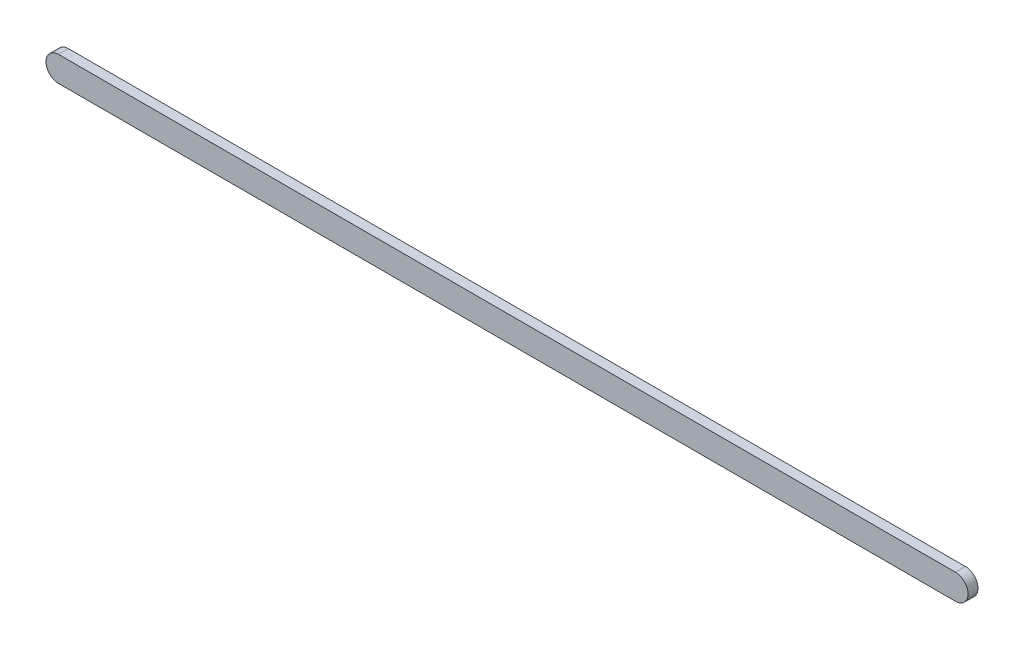
ISO-10303-21;
HEADER;
FILE_DESCRIPTION(('STEP AP214'),'2;1');
FILE_NAME('part.step','',(''),(''),'','','');
FILE_SCHEMA(('AUTOMOTIVE_DESIGN { 1 0 10303 214 1 1 1 1 }'));
ENDSEC;
DATA;
#1=APPLICATION_CONTEXT('core data for automotive mechanical design processes');
#2=APPLICATION_PROTOCOL_DEFINITION('international standard','automotive_design',2000,#1);
#3=PRODUCT_CONTEXT('',#1,'mechanical');
#4=PRODUCT('Part','Part','',(#3));
#5=PRODUCT_RELATED_PRODUCT_CATEGORY('part','',(#4));
#6=PRODUCT_DEFINITION_FORMATION('','',#4);
#7=PRODUCT_DEFINITION_CONTEXT('part definition',#1,'design');
#8=PRODUCT_DEFINITION('design','',#6,#7);
#9=PRODUCT_DEFINITION_SHAPE('','',#8);
#10=(LENGTH_UNIT() NAMED_UNIT(*) SI_UNIT(.MILLI.,.METRE.));
#11=(NAMED_UNIT(*) PLANE_ANGLE_UNIT() SI_UNIT($,.RADIAN.));
#12=(NAMED_UNIT(*) SI_UNIT($,.STERADIAN.) SOLID_ANGLE_UNIT());
#13=UNCERTAINTY_MEASURE_WITH_UNIT(LENGTH_MEASURE(1.E-05),#10,'distance_accuracy_value','');
#14=(GEOMETRIC_REPRESENTATION_CONTEXT(3) GLOBAL_UNCERTAINTY_ASSIGNED_CONTEXT((#13)) GLOBAL_UNIT_ASSIGNED_CONTEXT((#10,
#11,#12)) REPRESENTATION_CONTEXT('',''));
#15=CARTESIAN_POINT('',(0.,0.,0.));
#16=DIRECTION('',(0.,0.,1.));
#17=DIRECTION('',(1.,0.,0.));
#18=AXIS2_PLACEMENT_3D('',#15,#16,#17);
#19=CARTESIAN_POINT('',(109.6264,66.1924,0.));
#20=DIRECTION('',(0.,1.,0.));
#21=DIRECTION('',(1.,0.,0.));
#22=AXIS2_PLACEMENT_3D('',#19,#20,#21);
#23=PLANE('',#22);
#24=DIRECTION('',(1.,0.,0.));
#25=VECTOR('',#24,1.);
#26=CARTESIAN_POINT('',(109.6264,66.1924,0.1999996));
#27=LINE('',#26,#25);
#28=CARTESIAN_POINT('',(109.6264,66.1924,0.1999996));
#29=VERTEX_POINT('',#28);
#30=CARTESIAN_POINT('',(127.7112,66.1924,0.1999996));
#31=VERTEX_POINT('',#30);
#32=EDGE_CURVE('E11',#29,#31,#27,.T.);
#33=ORIENTED_EDGE('',*,*,#32,.F.);
#34=DIRECTION('',(0.,0.,1.));
#35=VECTOR('',#34,1.);
#36=CARTESIAN_POINT('',(109.6264,66.1924,0.));
#37=LINE('',#36,#35);
#38=CARTESIAN_POINT('',(109.6264,66.1924,0.));
#39=VERTEX_POINT('',#38);
#40=EDGE_CURVE('E24',#39,#29,#37,.T.);
#41=ORIENTED_EDGE('',*,*,#40,.F.);
#42=DIRECTION('',(1.,0.,0.));
#43=VECTOR('',#42,1.);
#44=CARTESIAN_POINT('',(109.6264,66.1924,0.));
#45=LINE('',#44,#43);
#46=CARTESIAN_POINT('',(127.7112,66.1924,0.));
#47=VERTEX_POINT('',#46);
#48=EDGE_CURVE('E75',#39,#47,#45,.T.);
#49=ORIENTED_EDGE('',*,*,#48,.T.);
#50=DIRECTION('',(0.,0.,1.));
#51=VECTOR('',#50,1.);
#52=CARTESIAN_POINT('',(127.7112,66.1924,0.));
#53=LINE('',#52,#51);
#54=EDGE_CURVE('E37',#47,#31,#53,.T.);
#55=ORIENTED_EDGE('',*,*,#54,.T.);
#56=EDGE_LOOP('',(#33,#41,#49,#55));
#57=FACE_BOUND('',#56,.T.);
#58=ADVANCED_FACE('F17',(#57),#23,.F.);
#59=CARTESIAN_POINT('',(127.7112,66.4464,0.));
#60=DIRECTION('',(0.,0.,-1.));
#61=DIRECTION('',(0.,-1.,0.));
#62=AXIS2_PLACEMENT_3D('',#59,#60,#61);
#63=CYLINDRICAL_SURFACE('',#62,0.253999999999995);
#64=CARTESIAN_POINT('',(127.7112,66.4464,0.1999996));
#65=DIRECTION('',(0.,0.,1.));
#66=DIRECTION('',(0.,-1.,0.));
#67=AXIS2_PLACEMENT_3D('',#64,#65,#66);
#68=CIRCLE('',#67,0.253999999999995);
#69=CARTESIAN_POINT('',(127.7112,66.7004,0.1999996));
#70=VERTEX_POINT('',#69);
#71=EDGE_CURVE('E83',#31,#70,#68,.T.);
#72=ORIENTED_EDGE('',*,*,#71,.F.);
#73=ORIENTED_EDGE('',*,*,#54,.F.);
#74=CARTESIAN_POINT('',(127.7112,66.4464,0.));
#75=DIRECTION('',(0.,0.,1.));
#76=DIRECTION('',(0.,-1.,0.));
#77=AXIS2_PLACEMENT_3D('',#74,#75,#76);
#78=CIRCLE('',#77,0.253999999999995);
#79=CARTESIAN_POINT('',(127.7112,66.7004,0.));
#80=VERTEX_POINT('',#79);
#81=EDGE_CURVE('E81',#47,#80,#78,.T.);
#82=ORIENTED_EDGE('',*,*,#81,.T.);
#83=DIRECTION('',(0.,0.,1.));
#84=VECTOR('',#83,1.);
#85=CARTESIAN_POINT('',(127.7112,66.7004,0.));
#86=LINE('',#85,#84);
#87=EDGE_CURVE('E67',#80,#70,#86,.T.);
#88=ORIENTED_EDGE('',*,*,#87,.T.);
#89=EDGE_LOOP('',(#72,#73,#82,#88));
#90=FACE_BOUND('',#89,.T.);
#91=ADVANCED_FACE('F89',(#90),#63,.T.);
#92=CARTESIAN_POINT('',(127.7112,66.7004,0.));
#93=DIRECTION('',(0.,-1.,0.));
#94=DIRECTION('',(-1.,0.,0.));
#95=AXIS2_PLACEMENT_3D('',#92,#93,#94);
#96=PLANE('',#95);
#97=DIRECTION('',(-1.,0.,0.));
#98=VECTOR('',#97,1.);
#99=CARTESIAN_POINT('',(127.7112,66.7004,0.1999996));
#100=LINE('',#99,#98);
#101=CARTESIAN_POINT('',(109.6264,66.7004,0.1999996));
#102=VERTEX_POINT('',#101);
#103=EDGE_CURVE('E71',#70,#102,#100,.T.);
#104=ORIENTED_EDGE('',*,*,#103,.F.);
#105=ORIENTED_EDGE('',*,*,#87,.F.);
#106=DIRECTION('',(-1.,0.,0.));
#107=VECTOR('',#106,1.);
#108=CARTESIAN_POINT('',(127.7112,66.7004,0.));
#109=LINE('',#108,#107);
#110=CARTESIAN_POINT('',(109.6264,66.7004,0.));
#111=VERTEX_POINT('',#110);
#112=EDGE_CURVE('E63',#80,#111,#109,.T.);
#113=ORIENTED_EDGE('',*,*,#112,.T.);
#114=DIRECTION('',(0.,0.,1.));
#115=VECTOR('',#114,1.);
#116=CARTESIAN_POINT('',(109.6264,66.7004,0.));
#117=LINE('',#116,#115);
#118=EDGE_CURVE('E53',#111,#102,#117,.T.);
#119=ORIENTED_EDGE('',*,*,#118,.T.);
#120=EDGE_LOOP('',(#104,#105,#113,#119));
#121=FACE_BOUND('',#120,.T.);
#122=ADVANCED_FACE('F66',(#121),#96,.F.);
#123=CARTESIAN_POINT('',(109.6264,66.4464,0.));
#124=DIRECTION('',(0.,0.,-1.));
#125=DIRECTION('',(0.,1.,0.));
#126=AXIS2_PLACEMENT_3D('',#123,#124,#125);
#127=CYLINDRICAL_SURFACE('',#126,0.254);
#128=CARTESIAN_POINT('',(109.6264,66.4464,0.1999996));
#129=DIRECTION('',(0.,0.,1.));
#130=DIRECTION('',(0.,1.,0.));
#131=AXIS2_PLACEMENT_3D('',#128,#129,#130);
#132=CIRCLE('',#131,0.254);
#133=EDGE_CURVE('E59',#102,#29,#132,.T.);
#134=ORIENTED_EDGE('',*,*,#133,.F.);
#135=ORIENTED_EDGE('',*,*,#118,.F.);
#136=CARTESIAN_POINT('',(109.6264,66.4464,0.));
#137=DIRECTION('',(0.,0.,1.));
#138=DIRECTION('',(0.,1.,0.));
#139=AXIS2_PLACEMENT_3D('',#136,#137,#138);
#140=CIRCLE('',#139,0.254);
#141=EDGE_CURVE('E57',#111,#39,#140,.T.);
#142=ORIENTED_EDGE('',*,*,#141,.T.);
#143=ORIENTED_EDGE('',*,*,#40,.T.);
#144=EDGE_LOOP('',(#134,#135,#142,#143));
#145=FACE_BOUND('',#144,.T.);
#146=ADVANCED_FACE('F55',(#145),#127,.T.);
#147=CARTESIAN_POINT('',(109.6264,66.1924,0.));
#148=DIRECTION('',(0.,0.,-1.));
#149=DIRECTION('',(-1.,0.,0.));
#150=AXIS2_PLACEMENT_3D('',#147,#148,#149);
#151=PLANE('',#150);
#152=ORIENTED_EDGE('',*,*,#141,.F.);
#153=ORIENTED_EDGE('',*,*,#112,.F.);
#154=ORIENTED_EDGE('',*,*,#81,.F.);
#155=ORIENTED_EDGE('',*,*,#48,.F.);
#156=EDGE_LOOP('',(#152,#153,#154,#155));
#157=FACE_BOUND('',#156,.T.);
#158=ADVANCED_FACE('F74',(#157),#151,.T.);
#159=CARTESIAN_POINT('',(109.6264,66.1924,0.1999996));
#160=DIRECTION('',(0.,0.,-1.));
#161=DIRECTION('',(-1.,0.,0.));
#162=AXIS2_PLACEMENT_3D('',#159,#160,#161);
#163=PLANE('',#162);
#164=ORIENTED_EDGE('',*,*,#32,.T.);
#165=ORIENTED_EDGE('',*,*,#71,.T.);
#166=ORIENTED_EDGE('',*,*,#103,.T.);
#167=ORIENTED_EDGE('',*,*,#133,.T.);
#168=EDGE_LOOP('',(#164,#165,#166,#167));
#169=FACE_BOUND('',#168,.T.);
#170=ADVANCED_FACE('F91',(#169),#163,.F.);
#171=CLOSED_SHELL('',(#58,#91,#122,#146,#158,#170));
#172=MANIFOLD_SOLID_BREP('B1',#171);
#173=ADVANCED_BREP_SHAPE_REPRESENTATION('',(#18,#172),#14);
#174=SHAPE_DEFINITION_REPRESENTATION(#9,#173);
ENDSEC;
END-ISO-10303-21;
